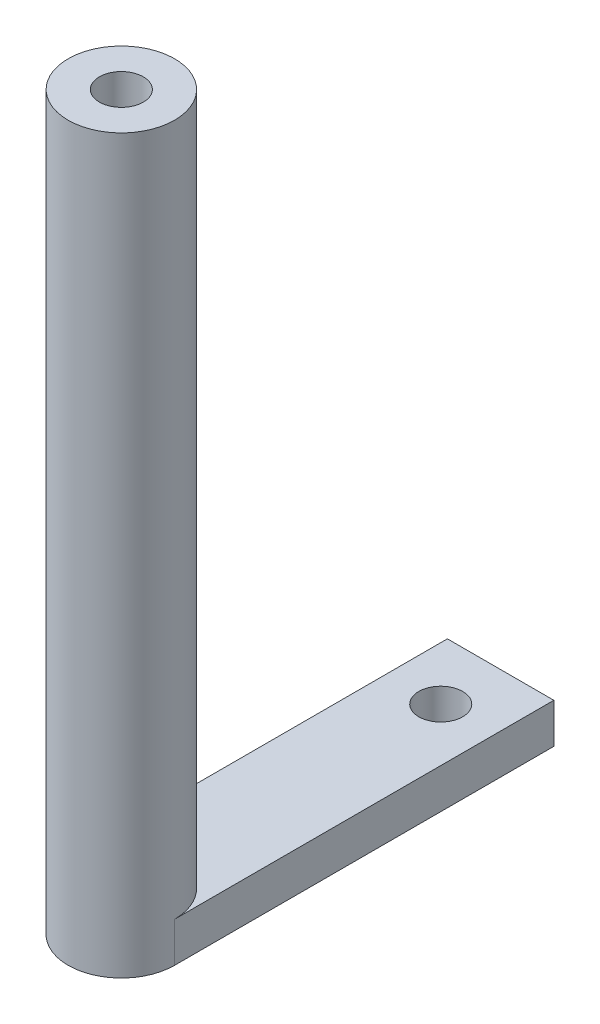
ISO-10303-21;
HEADER;
FILE_DESCRIPTION(('STEP AP214'),'2;1');
FILE_NAME('part.step','',(''),(''),'','','');
FILE_SCHEMA(('AUTOMOTIVE_DESIGN { 1 0 10303 214 1 1 1 1 }'));
ENDSEC;
DATA;
#1=APPLICATION_CONTEXT('core data for automotive mechanical design processes');
#2=APPLICATION_PROTOCOL_DEFINITION('international standard','automotive_design',2000,#1);
#3=PRODUCT_CONTEXT('',#1,'mechanical');
#4=PRODUCT('Part','Part','',(#3));
#5=PRODUCT_RELATED_PRODUCT_CATEGORY('part','',(#4));
#6=PRODUCT_DEFINITION_FORMATION('','',#4);
#7=PRODUCT_DEFINITION_CONTEXT('part definition',#1,'design');
#8=PRODUCT_DEFINITION('design','',#6,#7);
#9=PRODUCT_DEFINITION_SHAPE('','',#8);
#10=(LENGTH_UNIT() NAMED_UNIT(*) SI_UNIT(.MILLI.,.METRE.));
#11=(NAMED_UNIT(*) PLANE_ANGLE_UNIT() SI_UNIT($,.RADIAN.));
#12=(NAMED_UNIT(*) SI_UNIT($,.STERADIAN.) SOLID_ANGLE_UNIT());
#13=UNCERTAINTY_MEASURE_WITH_UNIT(LENGTH_MEASURE(1.E-05),#10,'distance_accuracy_value','');
#14=(GEOMETRIC_REPRESENTATION_CONTEXT(3) GLOBAL_UNCERTAINTY_ASSIGNED_CONTEXT((#13)) GLOBAL_UNIT_ASSIGNED_CONTEXT((#10,
#11,#12)) REPRESENTATION_CONTEXT('',''));
#15=CARTESIAN_POINT('',(0.,0.,0.));
#16=DIRECTION('',(0.,0.,1.));
#17=DIRECTION('',(1.,0.,0.));
#18=AXIS2_PLACEMENT_3D('',#15,#16,#17);
#19=CARTESIAN_POINT('',(-4.,3.,0.));
#20=DIRECTION('',(-1.,0.,0.));
#21=DIRECTION('',(0.,0.,1.));
#22=AXIS2_PLACEMENT_3D('',#19,#20,#21);
#23=PLANE('',#22);
#24=DIRECTION('',(0.,0.,-1.));
#25=VECTOR('',#24,1.);
#26=CARTESIAN_POINT('',(-4.,0.,0.));
#27=LINE('',#26,#25);
#28=CARTESIAN_POINT('',(-4.,0.,0.));
#29=VERTEX_POINT('',#28);
#30=CARTESIAN_POINT('',(-4.,0.,-28.5));
#31=VERTEX_POINT('',#30);
#32=EDGE_CURVE('E102',#29,#31,#27,.T.);
#33=ORIENTED_EDGE('',*,*,#32,.F.);
#34=DIRECTION('',(0.,-1.,0.));
#35=VECTOR('',#34,1.);
#36=CARTESIAN_POINT('',(-4.,3.,0.));
#37=LINE('',#36,#35);
#38=CARTESIAN_POINT('',(-4.,3.,0.));
#39=VERTEX_POINT('',#38);
#40=EDGE_CURVE('E11',#39,#29,#37,.T.);
#41=ORIENTED_EDGE('',*,*,#40,.F.);
#42=DIRECTION('',(0.,0.,-1.));
#43=VECTOR('',#42,1.);
#44=CARTESIAN_POINT('',(-4.,3.,0.));
#45=LINE('',#44,#43);
#46=CARTESIAN_POINT('',(-4.,3.,-28.5));
#47=VERTEX_POINT('',#46);
#48=EDGE_CURVE('E87',#39,#47,#45,.T.);
#49=ORIENTED_EDGE('',*,*,#48,.T.);
#50=DIRECTION('',(0.,-1.,0.));
#51=VECTOR('',#50,1.);
#52=CARTESIAN_POINT('',(-4.,3.,-28.5));
#53=LINE('',#52,#51);
#54=EDGE_CURVE('E53',#47,#31,#53,.T.);
#55=ORIENTED_EDGE('',*,*,#54,.T.);
#56=EDGE_LOOP('',(#33,#41,#49,#55));
#57=FACE_BOUND('',#56,.T.);
#58=ADVANCED_FACE('F37',(#57),#23,.T.);
#59=CARTESIAN_POINT('',(0.,3.,0.));
#60=DIRECTION('',(0.,-1.,0.));
#61=DIRECTION('',(0.,0.,-1.));
#62=AXIS2_PLACEMENT_3D('',#59,#60,#61);
#63=CYLINDRICAL_SURFACE('',#62,4.);
#64=CARTESIAN_POINT('',(0.,0.,0.));
#65=DIRECTION('',(0.,1.,0.));
#66=DIRECTION('',(0.,0.,1.));
#67=AXIS2_PLACEMENT_3D('',#64,#65,#66);
#68=CIRCLE('',#67,4.);
#69=CARTESIAN_POINT('',(4.,0.,0.));
#70=VERTEX_POINT('',#69);
#71=EDGE_CURVE('E95',#29,#70,#68,.T.);
#72=ORIENTED_EDGE('',*,*,#71,.T.);
#73=DIRECTION('',(0.,-1.,0.));
#74=VECTOR('',#73,1.);
#75=CARTESIAN_POINT('',(4.,3.,0.));
#76=LINE('',#75,#74);
#77=CARTESIAN_POINT('',(4.,3.,0.));
#78=VERTEX_POINT('',#77);
#79=EDGE_CURVE('E45',#78,#70,#76,.T.);
#80=ORIENTED_EDGE('',*,*,#79,.F.);
#81=CARTESIAN_POINT('',(0.,3.,0.));
#82=DIRECTION('',(0.,1.,0.));
#83=DIRECTION('',(0.,0.,1.));
#84=AXIS2_PLACEMENT_3D('',#81,#82,#83);
#85=CIRCLE('',#84,4.);
#86=EDGE_CURVE('E93',#78,#39,#85,.T.);
#87=ORIENTED_EDGE('',*,*,#86,.T.);
#88=ORIENTED_EDGE('',*,*,#40,.T.);
#89=EDGE_LOOP('',(#72,#80,#87,#88));
#90=FACE_BOUND('',#89,.T.);
#91=CARTESIAN_POINT('',(0.,55.,0.));
#92=DIRECTION('',(0.,1.,0.));
#93=DIRECTION('',(0.,0.,1.));
#94=AXIS2_PLACEMENT_3D('',#91,#92,#93);
#95=CIRCLE('',#94,4.);
#96=CARTESIAN_POINT('',(0.,55.,4.));
#97=VERTEX_POINT('',#96);
#98=EDGE_CURVE('E98',#97,#97,#95,.T.);
#99=ORIENTED_EDGE('',*,*,#98,.F.);
#100=EDGE_LOOP('',(#99));
#101=FACE_BOUND('',#100,.T.);
#102=ADVANCED_FACE('F91',(#90,#101),#63,.T.);
#103=CARTESIAN_POINT('',(4.,3.,0.));
#104=DIRECTION('',(-1.,0.,0.));
#105=DIRECTION('',(0.,0.,1.));
#106=AXIS2_PLACEMENT_3D('',#103,#104,#105);
#107=PLANE('',#106);
#108=DIRECTION('',(0.,0.,-1.));
#109=VECTOR('',#108,1.);
#110=CARTESIAN_POINT('',(4.,0.,0.));
#111=LINE('',#110,#109);
#112=CARTESIAN_POINT('',(4.,0.,-28.5));
#113=VERTEX_POINT('',#112);
#114=EDGE_CURVE('E117',#70,#113,#111,.T.);
#115=ORIENTED_EDGE('',*,*,#114,.T.);
#116=DIRECTION('',(0.,-1.,0.));
#117=VECTOR('',#116,1.);
#118=CARTESIAN_POINT('',(4.,3.,-28.5));
#119=LINE('',#118,#117);
#120=CARTESIAN_POINT('',(4.,3.,-28.5));
#121=VERTEX_POINT('',#120);
#122=EDGE_CURVE('E68',#121,#113,#119,.T.);
#123=ORIENTED_EDGE('',*,*,#122,.F.);
#124=DIRECTION('',(0.,0.,-1.));
#125=VECTOR('',#124,1.);
#126=CARTESIAN_POINT('',(4.,3.,0.));
#127=LINE('',#126,#125);
#128=EDGE_CURVE('E79',#78,#121,#127,.T.);
#129=ORIENTED_EDGE('',*,*,#128,.F.);
#130=ORIENTED_EDGE('',*,*,#79,.T.);
#131=EDGE_LOOP('',(#115,#123,#129,#130));
#132=FACE_BOUND('',#131,.T.);
#133=ADVANCED_FACE('F81',(#132),#107,.F.);
#134=CARTESIAN_POINT('',(0.,3.,-28.5));
#135=DIRECTION('',(0.,0.,-1.));
#136=DIRECTION('',(-1.,0.,0.));
#137=AXIS2_PLACEMENT_3D('',#134,#135,#136);
#138=PLANE('',#137);
#139=DIRECTION('',(1.,0.,0.));
#140=VECTOR('',#139,1.);
#141=CARTESIAN_POINT('',(0.,0.,-28.5));
#142=LINE('',#141,#140);
#143=EDGE_CURVE('E119',#31,#113,#142,.T.);
#144=ORIENTED_EDGE('',*,*,#143,.F.);
#145=ORIENTED_EDGE('',*,*,#54,.F.);
#146=DIRECTION('',(1.,0.,0.));
#147=VECTOR('',#146,1.);
#148=CARTESIAN_POINT('',(0.,3.,-28.5));
#149=LINE('',#148,#147);
#150=EDGE_CURVE('E86',#47,#121,#149,.T.);
#151=ORIENTED_EDGE('',*,*,#150,.T.);
#152=ORIENTED_EDGE('',*,*,#122,.T.);
#153=EDGE_LOOP('',(#144,#145,#151,#152));
#154=FACE_BOUND('',#153,.T.);
#155=ADVANCED_FACE('F131',(#154),#138,.T.);
#156=CARTESIAN_POINT('',(0.,3.,-24.));
#157=DIRECTION('',(0.,-1.,0.));
#158=DIRECTION('',(0.,0.,-1.));
#159=AXIS2_PLACEMENT_3D('',#156,#157,#158);
#160=CYLINDRICAL_SURFACE('',#159,1.65);
#161=CARTESIAN_POINT('',(0.,3.,-24.));
#162=DIRECTION('',(0.,1.,0.));
#163=DIRECTION('',(0.,0.,1.));
#164=AXIS2_PLACEMENT_3D('',#161,#162,#163);
#165=CIRCLE('',#164,1.65);
#166=CARTESIAN_POINT('',(0.,3.,-22.35));
#167=VERTEX_POINT('',#166);
#168=EDGE_CURVE('E112',#167,#167,#165,.T.);
#169=ORIENTED_EDGE('',*,*,#168,.T.);
#170=EDGE_LOOP('',(#169));
#171=FACE_BOUND('',#170,.T.);
#172=CARTESIAN_POINT('',(0.,0.,-24.));
#173=DIRECTION('',(0.,1.,0.));
#174=DIRECTION('',(0.,0.,1.));
#175=AXIS2_PLACEMENT_3D('',#172,#173,#174);
#176=CIRCLE('',#175,1.65);
#177=CARTESIAN_POINT('',(0.,0.,-22.35));
#178=VERTEX_POINT('',#177);
#179=EDGE_CURVE('E109',#178,#178,#176,.T.);
#180=ORIENTED_EDGE('',*,*,#179,.F.);
#181=EDGE_LOOP('',(#180));
#182=FACE_BOUND('',#181,.T.);
#183=ADVANCED_FACE('F129',(#171,#182),#160,.F.);
#184=CARTESIAN_POINT('',(0.,3.,0.));
#185=DIRECTION('',(0.,1.,0.));
#186=DIRECTION('',(0.,0.,1.));
#187=AXIS2_PLACEMENT_3D('',#184,#185,#186);
#188=PLANE('',#187);
#189=ORIENTED_EDGE('',*,*,#86,.F.);
#190=ORIENTED_EDGE('',*,*,#128,.T.);
#191=ORIENTED_EDGE('',*,*,#150,.F.);
#192=ORIENTED_EDGE('',*,*,#48,.F.);
#193=EDGE_LOOP('',(#189,#190,#191,#192));
#194=FACE_BOUND('',#193,.T.);
#195=ORIENTED_EDGE('',*,*,#168,.F.);
#196=EDGE_LOOP('',(#195));
#197=FACE_BOUND('',#196,.T.);
#198=ADVANCED_FACE('F96',(#194,#197),#188,.T.);
#199=CARTESIAN_POINT('',(0.,0.,0.));
#200=DIRECTION('',(0.,1.,0.));
#201=DIRECTION('',(0.,0.,1.));
#202=AXIS2_PLACEMENT_3D('',#199,#200,#201);
#203=PLANE('',#202);
#204=ORIENTED_EDGE('',*,*,#32,.T.);
#205=ORIENTED_EDGE('',*,*,#143,.T.);
#206=ORIENTED_EDGE('',*,*,#114,.F.);
#207=ORIENTED_EDGE('',*,*,#71,.F.);
#208=EDGE_LOOP('',(#204,#205,#206,#207));
#209=FACE_BOUND('',#208,.T.);
#210=ORIENTED_EDGE('',*,*,#179,.T.);
#211=EDGE_LOOP('',(#210));
#212=FACE_BOUND('',#211,.T.);
#213=ADVANCED_FACE('F127',(#209,#212),#203,.F.);
#214=CARTESIAN_POINT('',(0.,55.,0.));
#215=DIRECTION('',(0.,1.,0.));
#216=DIRECTION('',(0.,0.,1.));
#217=AXIS2_PLACEMENT_3D('',#214,#215,#216);
#218=PLANE('',#217);
#219=CARTESIAN_POINT('',(0.,55.,0.));
#220=DIRECTION('',(0.,1.,0.));
#221=DIRECTION('',(0.,0.,1.));
#222=AXIS2_PLACEMENT_3D('',#219,#220,#221);
#223=CIRCLE('',#222,1.65);
#224=CARTESIAN_POINT('',(0.,55.,1.65));
#225=VERTEX_POINT('',#224);
#226=EDGE_CURVE('E105',#225,#225,#223,.T.);
#227=ORIENTED_EDGE('',*,*,#226,.F.);
#228=EDGE_LOOP('',(#227));
#229=FACE_BOUND('',#228,.T.);
#230=ORIENTED_EDGE('',*,*,#98,.T.);
#231=EDGE_LOOP('',(#230));
#232=FACE_BOUND('',#231,.T.);
#233=ADVANCED_FACE('F147',(#229,#232),#218,.T.);
#234=CARTESIAN_POINT('',(0.,45.,0.));
#235=DIRECTION('',(0.,1.,0.));
#236=DIRECTION('',(0.,0.,1.));
#237=AXIS2_PLACEMENT_3D('',#234,#235,#236);
#238=CYLINDRICAL_SURFACE('',#237,1.65);
#239=CARTESIAN_POINT('',(0.,45.,0.));
#240=DIRECTION('',(0.,1.,0.));
#241=DIRECTION('',(0.,0.,1.));
#242=AXIS2_PLACEMENT_3D('',#239,#240,#241);
#243=CIRCLE('',#242,1.65);
#244=CARTESIAN_POINT('',(0.,45.,1.65));
#245=VERTEX_POINT('',#244);
#246=EDGE_CURVE('E99',#245,#245,#243,.T.);
#247=ORIENTED_EDGE('',*,*,#246,.F.);
#248=EDGE_LOOP('',(#247));
#249=FACE_BOUND('',#248,.T.);
#250=ORIENTED_EDGE('',*,*,#226,.T.);
#251=EDGE_LOOP('',(#250));
#252=FACE_BOUND('',#251,.T.);
#253=ADVANCED_FACE('F151',(#249,#252),#238,.F.);
#254=CARTESIAN_POINT('',(0.,45.,0.));
#255=DIRECTION('',(0.,1.,0.));
#256=DIRECTION('',(0.,0.,1.));
#257=AXIS2_PLACEMENT_3D('',#254,#255,#256);
#258=PLANE('',#257);
#259=ORIENTED_EDGE('',*,*,#246,.T.);
#260=EDGE_LOOP('',(#259));
#261=FACE_BOUND('',#260,.T.);
#262=ADVANCED_FACE('F157',(#261),#258,.T.);
#263=CLOSED_SHELL('',(#58,#102,#133,#155,#183,#198,#213,#233,#253,#262));
#264=MANIFOLD_SOLID_BREP('B2',#263);
#265=ADVANCED_BREP_SHAPE_REPRESENTATION('',(#18,#264),#14);
#266=SHAPE_DEFINITION_REPRESENTATION(#9,#265);
ENDSEC;
END-ISO-10303-21;
